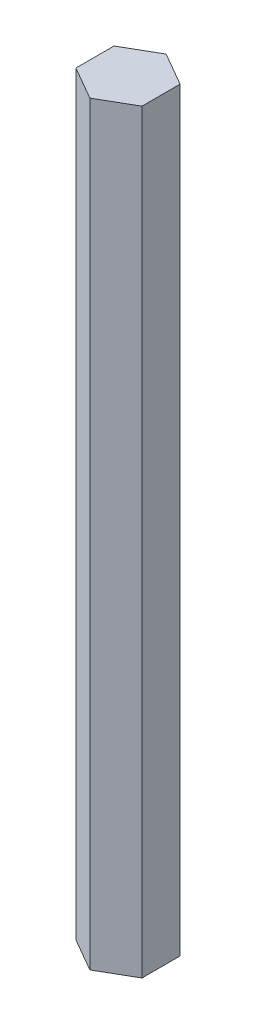
ISO-10303-21;
HEADER;
FILE_DESCRIPTION(('STEP AP214'),'2;1');
FILE_NAME('part.step','',(''),(''),'','','');
FILE_SCHEMA(('AUTOMOTIVE_DESIGN { 1 0 10303 214 1 1 1 1 }'));
ENDSEC;
DATA;
#1=APPLICATION_CONTEXT('core data for automotive mechanical design processes');
#2=APPLICATION_PROTOCOL_DEFINITION('international standard','automotive_design',2000,#1);
#3=PRODUCT_CONTEXT('',#1,'mechanical');
#4=PRODUCT('Part','Part','',(#3));
#5=PRODUCT_RELATED_PRODUCT_CATEGORY('part','',(#4));
#6=PRODUCT_DEFINITION_FORMATION('','',#4);
#7=PRODUCT_DEFINITION_CONTEXT('part definition',#1,'design');
#8=PRODUCT_DEFINITION('design','',#6,#7);
#9=PRODUCT_DEFINITION_SHAPE('','',#8);
#10=(LENGTH_UNIT() NAMED_UNIT(*) SI_UNIT(.MILLI.,.METRE.));
#11=(NAMED_UNIT(*) PLANE_ANGLE_UNIT() SI_UNIT($,.RADIAN.));
#12=(NAMED_UNIT(*) SI_UNIT($,.STERADIAN.) SOLID_ANGLE_UNIT());
#13=UNCERTAINTY_MEASURE_WITH_UNIT(LENGTH_MEASURE(1.E-05),#10,'distance_accuracy_value','');
#14=(GEOMETRIC_REPRESENTATION_CONTEXT(3) GLOBAL_UNCERTAINTY_ASSIGNED_CONTEXT((#13)) GLOBAL_UNIT_ASSIGNED_CONTEXT((#10,
#11,#12)) REPRESENTATION_CONTEXT('',''));
#15=CARTESIAN_POINT('',(0.,0.,0.));
#16=DIRECTION('',(0.,0.,1.));
#17=DIRECTION('',(1.,0.,0.));
#18=AXIS2_PLACEMENT_3D('',#15,#16,#17);
#19=CARTESIAN_POINT('',(3.12197762435538,101.6,-4.85786392071484));
#20=DIRECTION('',(-0.5,0.,0.866025403784439));
#21=DIRECTION('',(0.866025403784439,0.,0.5));
#22=AXIS2_PLACEMENT_3D('',#19,#20,#21);
#23=PLANE('',#22);
#24=DIRECTION('',(-0.866025403784439,0.,-0.5));
#25=VECTOR('',#24,1.);
#26=CARTESIAN_POINT('',(3.12197762435538,0.,-4.85786392071484));
#27=LINE('',#26,#25);
#28=CARTESIAN_POINT('',(3.12197762435538,0.,-4.85786392071484));
#29=VERTEX_POINT('',#28);
#30=CARTESIAN_POINT('',(-1.32302237564462,0.,-7.42418586726273));
#31=VERTEX_POINT('',#30);
#32=EDGE_CURVE('E120',#29,#31,#27,.T.);
#33=ORIENTED_EDGE('',*,*,#32,.T.);
#34=DIRECTION('',(0.,-1.,0.));
#35=VECTOR('',#34,1.);
#36=CARTESIAN_POINT('',(-1.32302237564462,101.6,-7.42418586726273));
#37=LINE('',#36,#35);
#38=CARTESIAN_POINT('',(-1.32302237564462,101.6,-7.42418586726273));
#39=VERTEX_POINT('',#38);
#40=EDGE_CURVE('E11',#39,#31,#37,.T.);
#41=ORIENTED_EDGE('',*,*,#40,.F.);
#42=DIRECTION('',(-0.866025403784439,0.,-0.5));
#43=VECTOR('',#42,1.);
#44=CARTESIAN_POINT('',(3.12197762435538,101.6,-4.85786392071484));
#45=LINE('',#44,#43);
#46=CARTESIAN_POINT('',(3.12197762435538,101.6,-4.85786392071484));
#47=VERTEX_POINT('',#46);
#48=EDGE_CURVE('E130',#47,#39,#45,.T.);
#49=ORIENTED_EDGE('',*,*,#48,.F.);
#50=DIRECTION('',(0.,-1.,0.));
#51=VECTOR('',#50,1.);
#52=CARTESIAN_POINT('',(3.12197762435538,101.6,-4.85786392071484));
#53=LINE('',#52,#51);
#54=EDGE_CURVE('E116',#47,#29,#53,.T.);
#55=ORIENTED_EDGE('',*,*,#54,.T.);
#56=EDGE_LOOP('',(#33,#41,#49,#55));
#57=FACE_BOUND('',#56,.T.);
#58=ADVANCED_FACE('F36',(#57),#23,.F.);
#59=CARTESIAN_POINT('',(-1.32302237564462,101.6,-7.42418586726273));
#60=DIRECTION('',(0.5,0.,0.866025403784439));
#61=DIRECTION('',(0.866025403784439,0.,-0.5));
#62=AXIS2_PLACEMENT_3D('',#59,#60,#61);
#63=PLANE('',#62);
#64=DIRECTION('',(-0.866025403784439,0.,0.5));
#65=VECTOR('',#64,1.);
#66=CARTESIAN_POINT('',(-1.32302237564462,0.,-7.42418586726273));
#67=LINE('',#66,#65);
#68=CARTESIAN_POINT('',(-5.76802237564462,0.,-4.85786392071484));
#69=VERTEX_POINT('',#68);
#70=EDGE_CURVE('E123',#31,#69,#67,.T.);
#71=ORIENTED_EDGE('',*,*,#70,.T.);
#72=DIRECTION('',(0.,-1.,0.));
#73=VECTOR('',#72,1.);
#74=CARTESIAN_POINT('',(-5.76802237564462,101.6,-4.85786392071484));
#75=LINE('',#74,#73);
#76=CARTESIAN_POINT('',(-5.76802237564462,101.6,-4.85786392071484));
#77=VERTEX_POINT('',#76);
#78=EDGE_CURVE('E44',#77,#69,#75,.T.);
#79=ORIENTED_EDGE('',*,*,#78,.F.);
#80=DIRECTION('',(-0.866025403784439,0.,0.5));
#81=VECTOR('',#80,1.);
#82=CARTESIAN_POINT('',(-1.32302237564462,101.6,-7.42418586726273));
#83=LINE('',#82,#81);
#84=EDGE_CURVE('E89',#39,#77,#83,.T.);
#85=ORIENTED_EDGE('',*,*,#84,.F.);
#86=ORIENTED_EDGE('',*,*,#40,.T.);
#87=EDGE_LOOP('',(#71,#79,#85,#86));
#88=FACE_BOUND('',#87,.T.);
#89=ADVANCED_FACE('F154',(#88),#63,.F.);
#90=CARTESIAN_POINT('',(-5.76802237564462,101.6,-4.85786392071484));
#91=DIRECTION('',(1.,0.,0.));
#92=DIRECTION('',(0.,0.,-1.));
#93=AXIS2_PLACEMENT_3D('',#90,#91,#92);
#94=PLANE('',#93);
#95=DIRECTION('',(0.,0.,1.));
#96=VECTOR('',#95,1.);
#97=CARTESIAN_POINT('',(-5.76802237564462,0.,-4.85786392071484));
#98=LINE('',#97,#96);
#99=CARTESIAN_POINT('',(-5.76802237564462,0.,0.274779972380931));
#100=VERTEX_POINT('',#99);
#101=EDGE_CURVE('E125',#69,#100,#98,.T.);
#102=ORIENTED_EDGE('',*,*,#101,.T.);
#103=DIRECTION('',(0.,-1.,0.));
#104=VECTOR('',#103,1.);
#105=CARTESIAN_POINT('',(-5.76802237564462,101.6,0.274779972380931));
#106=LINE('',#105,#104);
#107=CARTESIAN_POINT('',(-5.76802237564462,101.6,0.274779972380931));
#108=VERTEX_POINT('',#107);
#109=EDGE_CURVE('E111',#108,#100,#106,.T.);
#110=ORIENTED_EDGE('',*,*,#109,.F.);
#111=DIRECTION('',(0.,0.,1.));
#112=VECTOR('',#111,1.);
#113=CARTESIAN_POINT('',(-5.76802237564462,101.6,-4.85786392071484));
#114=LINE('',#113,#112);
#115=EDGE_CURVE('E102',#77,#108,#114,.T.);
#116=ORIENTED_EDGE('',*,*,#115,.F.);
#117=ORIENTED_EDGE('',*,*,#78,.T.);
#118=EDGE_LOOP('',(#102,#110,#116,#117));
#119=FACE_BOUND('',#118,.T.);
#120=ADVANCED_FACE('F136',(#119),#94,.F.);
#121=CARTESIAN_POINT('',(-5.76802237564462,101.6,0.274779972380931));
#122=DIRECTION('',(0.5,0.,-0.866025403784439));
#123=DIRECTION('',(-0.866025403784439,0.,-0.5));
#124=AXIS2_PLACEMENT_3D('',#121,#122,#123);
#125=PLANE('',#124);
#126=DIRECTION('',(0.866025403784439,0.,0.5));
#127=VECTOR('',#126,1.);
#128=CARTESIAN_POINT('',(-5.76802237564462,0.,0.274779972380931));
#129=LINE('',#128,#127);
#130=CARTESIAN_POINT('',(-1.32302237564462,0.,2.84110191892882));
#131=VERTEX_POINT('',#130);
#132=EDGE_CURVE('E110',#100,#131,#129,.T.);
#133=ORIENTED_EDGE('',*,*,#132,.T.);
#134=DIRECTION('',(0.,-1.,0.));
#135=VECTOR('',#134,1.);
#136=CARTESIAN_POINT('',(-1.32302237564462,101.6,2.84110191892882));
#137=LINE('',#136,#135);
#138=CARTESIAN_POINT('',(-1.32302237564462,101.6,2.84110191892882));
#139=VERTEX_POINT('',#138);
#140=EDGE_CURVE('E107',#139,#131,#137,.T.);
#141=ORIENTED_EDGE('',*,*,#140,.F.);
#142=DIRECTION('',(0.866025403784439,0.,0.5));
#143=VECTOR('',#142,1.);
#144=CARTESIAN_POINT('',(-5.76802237564462,101.6,0.274779972380931));
#145=LINE('',#144,#143);
#146=EDGE_CURVE('E96',#108,#139,#145,.T.);
#147=ORIENTED_EDGE('',*,*,#146,.F.);
#148=ORIENTED_EDGE('',*,*,#109,.T.);
#149=EDGE_LOOP('',(#133,#141,#147,#148));
#150=FACE_BOUND('',#149,.T.);
#151=ADVANCED_FACE('F108',(#150),#125,.F.);
#152=CARTESIAN_POINT('',(-1.32302237564462,101.6,2.84110191892882));
#153=DIRECTION('',(-0.5,0.,-0.866025403784439));
#154=DIRECTION('',(-0.866025403784439,0.,0.5));
#155=AXIS2_PLACEMENT_3D('',#152,#153,#154);
#156=PLANE('',#155);
#157=DIRECTION('',(0.866025403784439,0.,-0.5));
#158=VECTOR('',#157,1.);
#159=CARTESIAN_POINT('',(-1.32302237564462,0.,2.84110191892882));
#160=LINE('',#159,#158);
#161=CARTESIAN_POINT('',(3.12197762435538,0.,0.27477997238093));
#162=VERTEX_POINT('',#161);
#163=EDGE_CURVE('E75',#131,#162,#160,.T.);
#164=ORIENTED_EDGE('',*,*,#163,.T.);
#165=DIRECTION('',(0.,-1.,0.));
#166=VECTOR('',#165,1.);
#167=CARTESIAN_POINT('',(3.12197762435538,101.6,0.27477997238093));
#168=LINE('',#167,#166);
#169=CARTESIAN_POINT('',(3.12197762435538,101.6,0.27477997238093));
#170=VERTEX_POINT('',#169);
#171=EDGE_CURVE('E112',#170,#162,#168,.T.);
#172=ORIENTED_EDGE('',*,*,#171,.F.);
#173=DIRECTION('',(0.866025403784439,0.,-0.5));
#174=VECTOR('',#173,1.);
#175=CARTESIAN_POINT('',(-1.32302237564462,101.6,2.84110191892882));
#176=LINE('',#175,#174);
#177=EDGE_CURVE('E100',#139,#170,#176,.T.);
#178=ORIENTED_EDGE('',*,*,#177,.F.);
#179=ORIENTED_EDGE('',*,*,#140,.T.);
#180=EDGE_LOOP('',(#164,#172,#178,#179));
#181=FACE_BOUND('',#180,.T.);
#182=ADVANCED_FACE('F114',(#181),#156,.F.);
#183=CARTESIAN_POINT('',(3.12197762435538,101.6,0.27477997238093));
#184=DIRECTION('',(-1.,0.,0.));
#185=DIRECTION('',(0.,0.,1.));
#186=AXIS2_PLACEMENT_3D('',#183,#184,#185);
#187=PLANE('',#186);
#188=DIRECTION('',(0.,0.,-1.));
#189=VECTOR('',#188,1.);
#190=CARTESIAN_POINT('',(3.12197762435538,0.,0.27477997238093));
#191=LINE('',#190,#189);
#192=EDGE_CURVE('E81',#162,#29,#191,.T.);
#193=ORIENTED_EDGE('',*,*,#192,.T.);
#194=ORIENTED_EDGE('',*,*,#54,.F.);
#195=DIRECTION('',(0.,0.,-1.));
#196=VECTOR('',#195,1.);
#197=CARTESIAN_POINT('',(3.12197762435538,101.6,0.27477997238093));
#198=LINE('',#197,#196);
#199=EDGE_CURVE('E52',#170,#47,#198,.T.);
#200=ORIENTED_EDGE('',*,*,#199,.F.);
#201=ORIENTED_EDGE('',*,*,#171,.T.);
#202=EDGE_LOOP('',(#193,#194,#200,#201));
#203=FACE_BOUND('',#202,.T.);
#204=ADVANCED_FACE('F143',(#203),#187,.F.);
#205=CARTESIAN_POINT('',(0.,101.6,0.));
#206=DIRECTION('',(0.,1.,0.));
#207=DIRECTION('',(0.,0.,1.));
#208=AXIS2_PLACEMENT_3D('',#205,#206,#207);
#209=PLANE('',#208);
#210=ORIENTED_EDGE('',*,*,#48,.T.);
#211=ORIENTED_EDGE('',*,*,#84,.T.);
#212=ORIENTED_EDGE('',*,*,#115,.T.);
#213=ORIENTED_EDGE('',*,*,#146,.T.);
#214=ORIENTED_EDGE('',*,*,#177,.T.);
#215=ORIENTED_EDGE('',*,*,#199,.T.);
#216=EDGE_LOOP('',(#210,#211,#212,#213,#214,#215));
#217=FACE_BOUND('',#216,.T.);
#218=ADVANCED_FACE('F98',(#217),#209,.T.);
#219=CARTESIAN_POINT('',(0.,0.,0.));
#220=DIRECTION('',(0.,1.,0.));
#221=DIRECTION('',(0.,0.,1.));
#222=AXIS2_PLACEMENT_3D('',#219,#220,#221);
#223=PLANE('',#222);
#224=ORIENTED_EDGE('',*,*,#32,.F.);
#225=ORIENTED_EDGE('',*,*,#192,.F.);
#226=ORIENTED_EDGE('',*,*,#163,.F.);
#227=ORIENTED_EDGE('',*,*,#132,.F.);
#228=ORIENTED_EDGE('',*,*,#101,.F.);
#229=ORIENTED_EDGE('',*,*,#70,.F.);
#230=EDGE_LOOP('',(#224,#225,#226,#227,#228,#229));
#231=FACE_BOUND('',#230,.T.);
#232=ADVANCED_FACE('F139',(#231),#223,.F.);
#233=CLOSED_SHELL('',(#58,#89,#120,#151,#182,#204,#218,#232));
#234=MANIFOLD_SOLID_BREP('B2',#233);
#235=ADVANCED_BREP_SHAPE_REPRESENTATION('',(#18,#234),#14);
#236=SHAPE_DEFINITION_REPRESENTATION(#9,#235);
ENDSEC;
END-ISO-10303-21;
